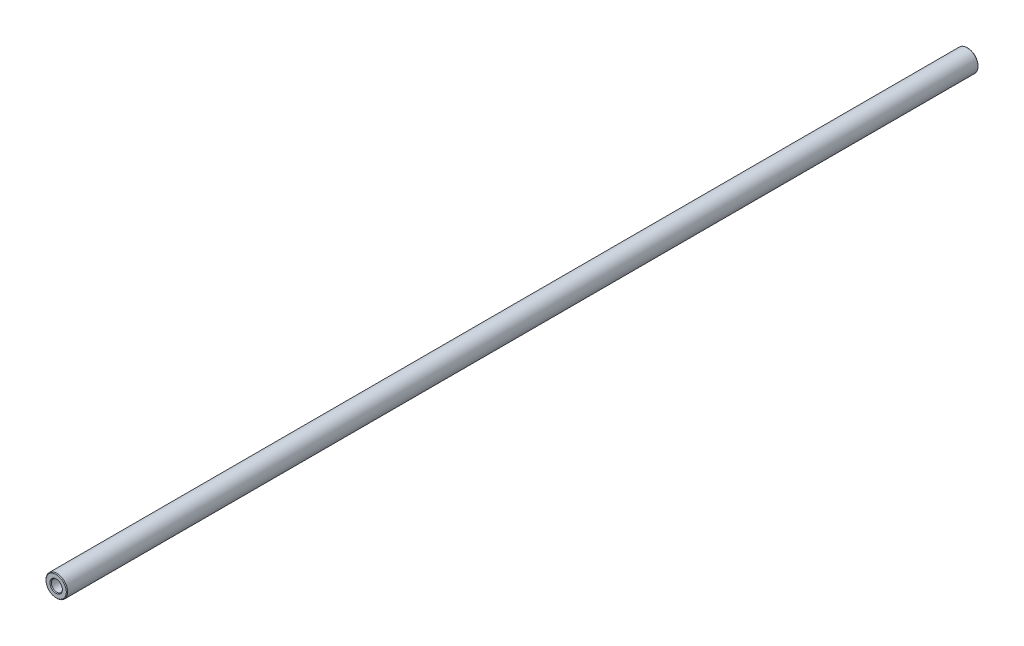
ISO-10303-21;
HEADER;
FILE_DESCRIPTION(('STEP AP214'),'2;1');
FILE_NAME('part.step','',(''),(''),'','','');
FILE_SCHEMA(('AUTOMOTIVE_DESIGN { 1 0 10303 214 1 1 1 1 }'));
ENDSEC;
DATA;
#1=APPLICATION_CONTEXT('core data for automotive mechanical design processes');
#2=APPLICATION_PROTOCOL_DEFINITION('international standard','automotive_design',2000,#1);
#3=PRODUCT_CONTEXT('',#1,'mechanical');
#4=PRODUCT('Part','Part','',(#3));
#5=PRODUCT_RELATED_PRODUCT_CATEGORY('part','',(#4));
#6=PRODUCT_DEFINITION_FORMATION('','',#4);
#7=PRODUCT_DEFINITION_CONTEXT('part definition',#1,'design');
#8=PRODUCT_DEFINITION('design','',#6,#7);
#9=PRODUCT_DEFINITION_SHAPE('','',#8);
#10=(LENGTH_UNIT() NAMED_UNIT(*) SI_UNIT(.MILLI.,.METRE.));
#11=(NAMED_UNIT(*) PLANE_ANGLE_UNIT() SI_UNIT($,.RADIAN.));
#12=(NAMED_UNIT(*) SI_UNIT($,.STERADIAN.) SOLID_ANGLE_UNIT());
#13=UNCERTAINTY_MEASURE_WITH_UNIT(LENGTH_MEASURE(1.E-05),#10,'distance_accuracy_value','');
#14=(GEOMETRIC_REPRESENTATION_CONTEXT(3) GLOBAL_UNCERTAINTY_ASSIGNED_CONTEXT((#13)) GLOBAL_UNIT_ASSIGNED_CONTEXT((#10,
#11,#12)) REPRESENTATION_CONTEXT('',''));
#15=CARTESIAN_POINT('',(0.,0.,0.));
#16=DIRECTION('',(0.,0.,1.));
#17=DIRECTION('',(1.,0.,0.));
#18=AXIS2_PLACEMENT_3D('',#15,#16,#17);
#19=CARTESIAN_POINT('',(0.,0.,333.375));
#20=DIRECTION('',(0.,0.,-1.));
#21=DIRECTION('',(-1.,0.,0.));
#22=AXIS2_PLACEMENT_3D('',#19,#20,#21);
#23=CYLINDRICAL_SURFACE('',#22,3.96875);
#24=CARTESIAN_POINT('',(0.,0.,333.121));
#25=DIRECTION('',(0.,0.,1.));
#26=DIRECTION('',(1.,0.,0.));
#27=AXIS2_PLACEMENT_3D('',#24,#25,#26);
#28=CIRCLE('',#27,3.96875);
#29=CARTESIAN_POINT('',(3.96875,0.,333.121));
#30=VERTEX_POINT('',#29);
#31=EDGE_CURVE('E73',#30,#30,#28,.F.);
#32=ORIENTED_EDGE('',*,*,#31,.T.);
#33=EDGE_LOOP('',(#32));
#34=FACE_BOUND('',#33,.T.);
#35=CARTESIAN_POINT('',(0.,0.,0.253999999999976));
#36=DIRECTION('',(0.,0.,1.));
#37=DIRECTION('',(1.,0.,0.));
#38=AXIS2_PLACEMENT_3D('',#35,#36,#37);
#39=CIRCLE('',#38,3.96875);
#40=CARTESIAN_POINT('',(3.96875,0.,0.253999999999976));
#41=VERTEX_POINT('',#40);
#42=EDGE_CURVE('E77',#41,#41,#39,.T.);
#43=ORIENTED_EDGE('',*,*,#42,.T.);
#44=EDGE_LOOP('',(#43));
#45=FACE_BOUND('',#44,.T.);
#46=ADVANCED_FACE('F47',(#34,#45),#23,.T.);
#47=CARTESIAN_POINT('',(0.,0.,333.375));
#48=DIRECTION('',(0.,0.,1.));
#49=DIRECTION('',(1.,0.,0.));
#50=AXIS2_PLACEMENT_3D('',#47,#48,#49);
#51=PLANE('',#50);
#52=CARTESIAN_POINT('',(0.,0.,333.375));
#53=DIRECTION('',(0.,0.,1.));
#54=DIRECTION('',(1.,0.,0.));
#55=AXIS2_PLACEMENT_3D('',#52,#53,#54);
#56=CIRCLE('',#55,3.71475000000002);
#57=CARTESIAN_POINT('',(3.71475000000002,0.,333.375));
#58=VERTEX_POINT('',#57);
#59=EDGE_CURVE('E81',#58,#58,#56,.T.);
#60=ORIENTED_EDGE('',*,*,#59,.T.);
#61=EDGE_LOOP('',(#60));
#62=FACE_BOUND('',#61,.T.);
#63=CARTESIAN_POINT('',(0.,0.,333.375));
#64=DIRECTION('',(0.,0.,1.));
#65=DIRECTION('',(1.,0.,0.));
#66=AXIS2_PLACEMENT_3D('',#63,#64,#65);
#67=CIRCLE('',#66,2.28600000000004);
#68=CARTESIAN_POINT('',(2.28600000000004,0.,333.375));
#69=VERTEX_POINT('',#68);
#70=EDGE_CURVE('E85',#69,#69,#67,.F.);
#71=ORIENTED_EDGE('',*,*,#70,.T.);
#72=EDGE_LOOP('',(#71));
#73=FACE_BOUND('',#72,.T.);
#74=ADVANCED_FACE('F115',(#62,#73),#51,.T.);
#75=CARTESIAN_POINT('',(0.,0.,0.));
#76=DIRECTION('',(0.,0.,1.));
#77=DIRECTION('',(1.,0.,0.));
#78=AXIS2_PLACEMENT_3D('',#75,#76,#77);
#79=PLANE('',#78);
#80=CARTESIAN_POINT('',(0.,0.,0.));
#81=DIRECTION('',(0.,0.,1.));
#82=DIRECTION('',(1.,0.,0.));
#83=AXIS2_PLACEMENT_3D('',#80,#81,#82);
#84=CIRCLE('',#83,3.71475000000002);
#85=CARTESIAN_POINT('',(3.71475000000002,0.,0.));
#86=VERTEX_POINT('',#85);
#87=EDGE_CURVE('E56',#86,#86,#84,.F.);
#88=ORIENTED_EDGE('',*,*,#87,.T.);
#89=EDGE_LOOP('',(#88));
#90=FACE_BOUND('',#89,.T.);
#91=CARTESIAN_POINT('',(0.,0.,0.));
#92=DIRECTION('',(0.,0.,1.));
#93=DIRECTION('',(1.,0.,0.));
#94=AXIS2_PLACEMENT_3D('',#91,#92,#93);
#95=CIRCLE('',#94,2.28600000000007);
#96=CARTESIAN_POINT('',(2.28600000000007,0.,0.));
#97=VERTEX_POINT('',#96);
#98=EDGE_CURVE('E62',#97,#97,#95,.T.);
#99=ORIENTED_EDGE('',*,*,#98,.T.);
#100=EDGE_LOOP('',(#99));
#101=FACE_BOUND('',#100,.T.);
#102=ADVANCED_FACE('F120',(#90,#101),#79,.F.);
#103=CARTESIAN_POINT('',(0.,0.,320.675));
#104=DIRECTION('',(0.,0.,1.));
#105=DIRECTION('',(1.,0.,0.));
#106=AXIS2_PLACEMENT_3D('',#103,#104,#105);
#107=CYLINDRICAL_SURFACE('',#106,2.032);
#108=CARTESIAN_POINT('',(0.,0.,333.121));
#109=DIRECTION('',(0.,0.,1.));
#110=DIRECTION('',(1.,0.,0.));
#111=AXIS2_PLACEMENT_3D('',#108,#109,#110);
#112=CIRCLE('',#111,2.032);
#113=CARTESIAN_POINT('',(2.032,0.,333.121));
#114=VERTEX_POINT('',#113);
#115=EDGE_CURVE('E67',#114,#114,#112,.T.);
#116=ORIENTED_EDGE('',*,*,#115,.T.);
#117=EDGE_LOOP('',(#116));
#118=FACE_BOUND('',#117,.T.);
#119=CARTESIAN_POINT('',(0.,0.,320.675));
#120=DIRECTION('',(0.,0.,1.));
#121=DIRECTION('',(1.,0.,0.));
#122=AXIS2_PLACEMENT_3D('',#119,#120,#121);
#123=CIRCLE('',#122,2.032);
#124=CARTESIAN_POINT('',(2.032,0.,320.675));
#125=VERTEX_POINT('',#124);
#126=EDGE_CURVE('E89',#125,#125,#123,.T.);
#127=ORIENTED_EDGE('',*,*,#126,.F.);
#128=EDGE_LOOP('',(#127));
#129=FACE_BOUND('',#128,.T.);
#130=ADVANCED_FACE('F111',(#118,#129),#107,.F.);
#131=CARTESIAN_POINT('',(0.,0.,320.675));
#132=DIRECTION('',(0.,0.,1.));
#133=DIRECTION('',(1.,0.,0.));
#134=AXIS2_PLACEMENT_3D('',#131,#132,#133);
#135=PLANE('',#134);
#136=ORIENTED_EDGE('',*,*,#126,.T.);
#137=EDGE_LOOP('',(#136));
#138=FACE_BOUND('',#137,.T.);
#139=ADVANCED_FACE('F101',(#138),#135,.T.);
#140=CARTESIAN_POINT('',(0.,0.,12.7));
#141=DIRECTION('',(0.,0.,-1.));
#142=DIRECTION('',(-1.,0.,0.));
#143=AXIS2_PLACEMENT_3D('',#140,#141,#142);
#144=CYLINDRICAL_SURFACE('',#143,2.032);
#145=CARTESIAN_POINT('',(0.,0.,0.254000000000046));
#146=DIRECTION('',(0.,0.,1.));
#147=DIRECTION('',(1.,0.,0.));
#148=AXIS2_PLACEMENT_3D('',#145,#146,#147);
#149=CIRCLE('',#148,2.032);
#150=CARTESIAN_POINT('',(2.032,0.,0.254000000000046));
#151=VERTEX_POINT('',#150);
#152=EDGE_CURVE('E10',#151,#151,#149,.F.);
#153=ORIENTED_EDGE('',*,*,#152,.T.);
#154=EDGE_LOOP('',(#153));
#155=FACE_BOUND('',#154,.T.);
#156=CARTESIAN_POINT('',(0.,0.,12.7));
#157=DIRECTION('',(0.,0.,-1.));
#158=DIRECTION('',(-1.,0.,0.));
#159=AXIS2_PLACEMENT_3D('',#156,#157,#158);
#160=CIRCLE('',#159,2.032);
#161=CARTESIAN_POINT('',(-2.032,0.,12.7));
#162=VERTEX_POINT('',#161);
#163=EDGE_CURVE('E93',#162,#162,#160,.T.);
#164=ORIENTED_EDGE('',*,*,#163,.F.);
#165=EDGE_LOOP('',(#164));
#166=FACE_BOUND('',#165,.T.);
#167=ADVANCED_FACE('F99',(#155,#166),#144,.F.);
#168=CARTESIAN_POINT('',(0.,0.,12.7));
#169=DIRECTION('',(0.,0.,-1.));
#170=DIRECTION('',(-1.,0.,0.));
#171=AXIS2_PLACEMENT_3D('',#168,#169,#170);
#172=PLANE('',#171);
#173=ORIENTED_EDGE('',*,*,#163,.T.);
#174=EDGE_LOOP('',(#173));
#175=FACE_BOUND('',#174,.T.);
#176=ADVANCED_FACE('F97',(#175),#172,.T.);
#177=CARTESIAN_POINT('',(0.,0.,333.375));
#178=DIRECTION('',(0.,0.,-1.));
#179=DIRECTION('',(-1.,0.,0.));
#180=AXIS2_PLACEMENT_3D('',#177,#178,#179);
#181=CONICAL_SURFACE('',#180,3.71475000000002,0.78539816339746);
#182=ORIENTED_EDGE('',*,*,#31,.F.);
#183=EDGE_LOOP('',(#182));
#184=FACE_BOUND('',#183,.T.);
#185=ORIENTED_EDGE('',*,*,#59,.F.);
#186=EDGE_LOOP('',(#185));
#187=FACE_BOUND('',#186,.T.);
#188=ADVANCED_FACE('F108',(#184,#187),#181,.T.);
#189=CARTESIAN_POINT('',(0.,0.,333.121));
#190=DIRECTION('',(0.,0.,1.));
#191=DIRECTION('',(1.,0.,0.));
#192=AXIS2_PLACEMENT_3D('',#189,#190,#191);
#193=CONICAL_SURFACE('',#192,2.032,0.78539816339746);
#194=ORIENTED_EDGE('',*,*,#70,.F.);
#195=EDGE_LOOP('',(#194));
#196=FACE_BOUND('',#195,.T.);
#197=ORIENTED_EDGE('',*,*,#115,.F.);
#198=EDGE_LOOP('',(#197));
#199=FACE_BOUND('',#198,.T.);
#200=ADVANCED_FACE('F131',(#196,#199),#193,.F.);
#201=CARTESIAN_POINT('',(0.,0.,0.253999999999976));
#202=DIRECTION('',(0.,0.,1.));
#203=DIRECTION('',(1.,0.,0.));
#204=AXIS2_PLACEMENT_3D('',#201,#202,#203);
#205=CONICAL_SURFACE('',#204,3.96875,0.78539816339746);
#206=ORIENTED_EDGE('',*,*,#87,.F.);
#207=EDGE_LOOP('',(#206));
#208=FACE_BOUND('',#207,.T.);
#209=ORIENTED_EDGE('',*,*,#42,.F.);
#210=EDGE_LOOP('',(#209));
#211=FACE_BOUND('',#210,.T.);
#212=ADVANCED_FACE('F137',(#208,#211),#205,.T.);
#213=CARTESIAN_POINT('',(0.,0.,0.254000000000046));
#214=DIRECTION('',(0.,0.,-1.));
#215=DIRECTION('',(-1.,0.,0.));
#216=AXIS2_PLACEMENT_3D('',#213,#214,#215);
#217=CONICAL_SURFACE('',#216,2.032,0.785398163397488);
#218=ORIENTED_EDGE('',*,*,#98,.F.);
#219=EDGE_LOOP('',(#218));
#220=FACE_BOUND('',#219,.T.);
#221=ORIENTED_EDGE('',*,*,#152,.F.);
#222=EDGE_LOOP('',(#221));
#223=FACE_BOUND('',#222,.T.);
#224=ADVANCED_FACE('F50',(#220,#223),#217,.F.);
#225=CLOSED_SHELL('',(#46,#74,#102,#130,#139,#167,#176,#188,#200,#212,#224));
#226=MANIFOLD_SOLID_BREP('B2',#225);
#227=ADVANCED_BREP_SHAPE_REPRESENTATION('',(#18,#226),#14);
#228=SHAPE_DEFINITION_REPRESENTATION(#9,#227);
ENDSEC;
END-ISO-10303-21;
